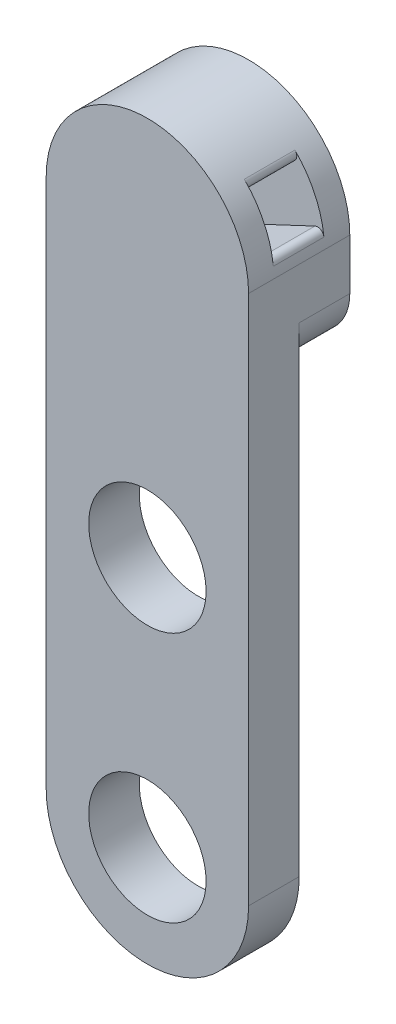
ISO-10303-21;
HEADER;
FILE_DESCRIPTION(('STEP AP214'),'2;1');
FILE_NAME('part.step','',(''),(''),'','','');
FILE_SCHEMA(('AUTOMOTIVE_DESIGN { 1 0 10303 214 1 1 1 1 }'));
ENDSEC;
DATA;
#1=APPLICATION_CONTEXT('core data for automotive mechanical design processes');
#2=APPLICATION_PROTOCOL_DEFINITION('international standard','automotive_design',2000,#1);
#3=PRODUCT_CONTEXT('',#1,'mechanical');
#4=PRODUCT('Part','Part','',(#3));
#5=PRODUCT_RELATED_PRODUCT_CATEGORY('part','',(#4));
#6=PRODUCT_DEFINITION_FORMATION('','',#4);
#7=PRODUCT_DEFINITION_CONTEXT('part definition',#1,'design');
#8=PRODUCT_DEFINITION('design','',#6,#7);
#9=PRODUCT_DEFINITION_SHAPE('','',#8);
#10=(LENGTH_UNIT() NAMED_UNIT(*) SI_UNIT(.MILLI.,.METRE.));
#11=(NAMED_UNIT(*) PLANE_ANGLE_UNIT() SI_UNIT($,.RADIAN.));
#12=(NAMED_UNIT(*) SI_UNIT($,.STERADIAN.) SOLID_ANGLE_UNIT());
#13=UNCERTAINTY_MEASURE_WITH_UNIT(LENGTH_MEASURE(1.E-05),#10,'distance_accuracy_value','');
#14=(GEOMETRIC_REPRESENTATION_CONTEXT(3) GLOBAL_UNCERTAINTY_ASSIGNED_CONTEXT((#13)) GLOBAL_UNIT_ASSIGNED_CONTEXT((#10,
#11,#12)) REPRESENTATION_CONTEXT('',''));
#15=CARTESIAN_POINT('',(0.,0.,0.));
#16=DIRECTION('',(0.,0.,1.));
#17=DIRECTION('',(1.,0.,0.));
#18=AXIS2_PLACEMENT_3D('',#15,#16,#17);
#19=CARTESIAN_POINT('',(0.,0.,0.));
#20=DIRECTION('',(0.,0.,1.));
#21=DIRECTION('',(1.,0.,0.));
#22=AXIS2_PLACEMENT_3D('',#19,#20,#21);
#23=PLANE('',#22);
#24=CARTESIAN_POINT('',(14.2874647221787,0.0317500000000005,0.));
#25=DIRECTION('',(0.,0.,1.));
#26=DIRECTION('',(1.,0.,0.));
#27=AXIS2_PLACEMENT_3D('',#24,#25,#26);
#28=CIRCLE('',#27,1.8415);
#29=CARTESIAN_POINT('',(16.1289647221787,0.0317500000000005,0.));
#30=VERTEX_POINT('',#29);
#31=EDGE_CURVE('E210',#30,#30,#28,.T.);
#32=ORIENTED_EDGE('',*,*,#31,.T.);
#33=EDGE_LOOP('',(#32));
#34=FACE_BOUND('',#33,.T.);
#35=CARTESIAN_POINT('',(14.2874647221787,7.90575,0.));
#36=DIRECTION('',(0.,0.,1.));
#37=DIRECTION('',(1.,0.,0.));
#38=AXIS2_PLACEMENT_3D('',#35,#36,#37);
#39=CIRCLE('',#38,1.8415);
#40=CARTESIAN_POINT('',(16.1289647221787,7.90575,0.));
#41=VERTEX_POINT('',#40);
#42=EDGE_CURVE('E205',#41,#41,#39,.T.);
#43=ORIENTED_EDGE('',*,*,#42,.T.);
#44=EDGE_LOOP('',(#43));
#45=FACE_BOUND('',#44,.T.);
#46=DIRECTION('',(0.,-1.,0.));
#47=VECTOR('',#46,1.);
#48=CARTESIAN_POINT('',(11.1124647221787,0.,0.));
#49=LINE('',#48,#47);
#50=CARTESIAN_POINT('',(11.1124647221787,14.1838734793715,0.));
#51=VERTEX_POINT('',#50);
#52=CARTESIAN_POINT('',(11.1124647221787,0.0317500000000005,0.));
#53=VERTEX_POINT('',#52);
#54=EDGE_CURVE('E229',#51,#53,#49,.T.);
#55=ORIENTED_EDGE('',*,*,#54,.F.);
#56=CARTESIAN_POINT('',(11.3109149221787,14.1838734793715,0.));
#57=DIRECTION('',(0.,0.,1.));
#58=DIRECTION('',(1.,0.,0.));
#59=AXIS2_PLACEMENT_3D('',#56,#57,#58);
#60=CIRCLE('',#59,0.1984502);
#61=CARTESIAN_POINT('',(11.2263437288073,14.3634011795511,0.));
#62=VERTEX_POINT('',#61);
#63=EDGE_CURVE('E321',#51,#62,#60,.F.);
#64=ORIENTED_EDGE('',*,*,#63,.T.);
#65=DIRECTION('',(-0.904648623078337,-0.426158267269884,0.));
#66=VECTOR('',#65,1.);
#67=CARTESIAN_POINT('',(18.4427205728927,17.7628632175049,0.));
#68=LINE('',#67,#66);
#69=CARTESIAN_POINT('',(11.466359185223,14.4764667040152,0.));
#70=VERTEX_POINT('',#69);
#71=EDGE_CURVE('E279',#70,#62,#68,.T.);
#72=ORIENTED_EDGE('',*,*,#71,.F.);
#73=CARTESIAN_POINT('',(11.5509303785944,14.2969390038356,0.));
#74=DIRECTION('',(0.,0.,1.));
#75=DIRECTION('',(1.,0.,0.));
#76=AXIS2_PLACEMENT_3D('',#73,#74,#75);
#77=CIRCLE('',#76,0.1984502);
#78=CARTESIAN_POINT('',(11.386770608879,14.1854309239174,0.));
#79=VERTEX_POINT('',#78);
#80=EDGE_CURVE('E49',#70,#79,#77,.T.);
#81=ORIENTED_EDGE('',*,*,#80,.T.);
#82=CARTESIAN_POINT('',(12.6999647221787,15.0774384747796,0.));
#83=DIRECTION('',(0.,0.,1.));
#84=DIRECTION('',(1.,0.,0.));
#85=AXIS2_PLACEMENT_3D('',#82,#83,#84);
#86=CIRCLE('',#85,1.5875);
#87=CARTESIAN_POINT('',(13.2023381399002,13.5715244004823,0.));
#88=VERTEX_POINT('',#87);
#89=EDGE_CURVE('E287',#79,#88,#86,.T.);
#90=ORIENTED_EDGE('',*,*,#89,.T.);
#91=CARTESIAN_POINT('',(14.2874647221787,10.31875,0.));
#92=DIRECTION('',(0.,0.,-1.));
#93=DIRECTION('',(-1.,0.,0.));
#94=AXIS2_PLACEMENT_3D('',#91,#92,#93);
#95=CIRCLE('',#94,3.429);
#96=CARTESIAN_POINT('',(15.3725913044571,13.5715244004822,0.));
#97=VERTEX_POINT('',#96);
#98=EDGE_CURVE('E195',#88,#97,#95,.T.);
#99=ORIENTED_EDGE('',*,*,#98,.T.);
#100=CARTESIAN_POINT('',(15.8749647221787,15.0774384747796,0.));
#101=DIRECTION('',(0.,0.,1.));
#102=DIRECTION('',(1.,0.,0.));
#103=AXIS2_PLACEMENT_3D('',#100,#101,#102);
#104=CIRCLE('',#103,1.5875);
#105=CARTESIAN_POINT('',(17.4624647221787,15.0774384747796,0.));
#106=VERTEX_POINT('',#105);
#107=EDGE_CURVE('E283',#97,#106,#104,.T.);
#108=ORIENTED_EDGE('',*,*,#107,.T.);
#109=DIRECTION('',(0.,-1.,0.));
#110=VECTOR('',#109,1.);
#111=CARTESIAN_POINT('',(17.4624647221787,0.,0.));
#112=LINE('',#111,#110);
#113=CARTESIAN_POINT('',(17.4624647221787,0.0317500000000005,0.));
#114=VERTEX_POINT('',#113);
#115=EDGE_CURVE('E236',#106,#114,#112,.T.);
#116=ORIENTED_EDGE('',*,*,#115,.T.);
#117=CARTESIAN_POINT('',(14.2874647221787,0.0317500000000005,0.));
#118=DIRECTION('',(0.,0.,1.));
#119=DIRECTION('',(1.,0.,0.));
#120=AXIS2_PLACEMENT_3D('',#117,#118,#119);
#121=CIRCLE('',#120,3.175);
#122=EDGE_CURVE('E232',#53,#114,#121,.T.);
#123=ORIENTED_EDGE('',*,*,#122,.F.);
#124=EDGE_LOOP('',(#55,#64,#72,#81,#90,#99,#108,#116,#123));
#125=FACE_BOUND('',#124,.T.);
#126=ADVANCED_FACE('F40',(#34,#45,#125),#23,.F.);
#127=CARTESIAN_POINT('',(11.1124647221787,0.,1.5875));
#128=DIRECTION('',(1.,0.,0.));
#129=DIRECTION('',(0.,1.,0.));
#130=AXIS2_PLACEMENT_3D('',#127,#128,#129);
#131=PLANE('',#130);
#132=DIRECTION('',(0.,0.,1.));
#133=VECTOR('',#132,1.);
#134=CARTESIAN_POINT('',(11.1124647221787,16.3774327789452,1.5875));
#135=LINE('',#134,#133);
#136=CARTESIAN_POINT('',(11.1124647221787,16.3774327789452,-0.79375));
#137=VERTEX_POINT('',#136);
#138=CARTESIAN_POINT('',(11.1124647221787,16.3774327789452,0.79375));
#139=VERTEX_POINT('',#138);
#140=EDGE_CURVE('E294',#137,#139,#135,.T.);
#141=ORIENTED_EDGE('',*,*,#140,.T.);
#142=DIRECTION('',(0.,-1.,0.));
#143=VECTOR('',#142,1.);
#144=CARTESIAN_POINT('',(11.1124647221787,0.,0.79375));
#145=LINE('',#144,#143);
#146=CARTESIAN_POINT('',(11.1124647221787,14.1838734793715,0.79375));
#147=VERTEX_POINT('',#146);
#148=EDGE_CURVE('E358',#139,#147,#145,.T.);
#149=ORIENTED_EDGE('',*,*,#148,.T.);
#150=DIRECTION('',(0.,0.,-1.));
#151=VECTOR('',#150,1.);
#152=CARTESIAN_POINT('',(11.1124647221787,14.1838734793715,1.5875));
#153=LINE('',#152,#151);
#154=EDGE_CURVE('E290',#147,#51,#153,.T.);
#155=ORIENTED_EDGE('',*,*,#154,.T.);
#156=ORIENTED_EDGE('',*,*,#54,.T.);
#157=DIRECTION('',(0.,0.,-1.));
#158=VECTOR('',#157,1.);
#159=CARTESIAN_POINT('',(11.1124647221787,0.0317500000000005,1.5875));
#160=LINE('',#159,#158);
#161=CARTESIAN_POINT('',(11.1124647221787,0.0317500000000005,1.5875));
#162=VERTEX_POINT('',#161);
#163=EDGE_CURVE('E248',#162,#53,#160,.T.);
#164=ORIENTED_EDGE('',*,*,#163,.F.);
#165=DIRECTION('',(0.,-1.,0.));
#166=VECTOR('',#165,1.);
#167=CARTESIAN_POINT('',(11.1124647221787,0.,1.5875));
#168=LINE('',#167,#166);
#169=CARTESIAN_POINT('',(11.1124647221787,16.66875,1.5875));
#170=VERTEX_POINT('',#169);
#171=EDGE_CURVE('E174',#170,#162,#168,.T.);
#172=ORIENTED_EDGE('',*,*,#171,.F.);
#173=DIRECTION('',(0.,0.,-1.));
#174=VECTOR('',#173,1.);
#175=CARTESIAN_POINT('',(11.1124647221787,16.66875,1.5875));
#176=LINE('',#175,#174);
#177=CARTESIAN_POINT('',(11.1124647221787,16.66875,-1.5875));
#178=VERTEX_POINT('',#177);
#179=EDGE_CURVE('E166',#170,#178,#176,.T.);
#180=ORIENTED_EDGE('',*,*,#179,.T.);
#181=DIRECTION('',(0.,-1.,0.));
#182=VECTOR('',#181,1.);
#183=CARTESIAN_POINT('',(11.1124647221787,0.,-1.5875));
#184=LINE('',#183,#182);
#185=CARTESIAN_POINT('',(11.1124647221787,15.0774384747796,-1.5875));
#186=VERTEX_POINT('',#185);
#187=EDGE_CURVE('E170',#178,#186,#184,.T.);
#188=ORIENTED_EDGE('',*,*,#187,.T.);
#189=DIRECTION('',(0.,0.,-1.));
#190=VECTOR('',#189,1.);
#191=CARTESIAN_POINT('',(11.1124647221787,15.0774384747796,1.5875));
#192=LINE('',#191,#190);
#193=CARTESIAN_POINT('',(11.1124647221787,15.0774384747796,-0.79375));
#194=VERTEX_POINT('',#193);
#195=EDGE_CURVE('E274',#186,#194,#192,.F.);
#196=ORIENTED_EDGE('',*,*,#195,.T.);
#197=DIRECTION('',(0.,1.,0.));
#198=VECTOR('',#197,1.);
#199=CARTESIAN_POINT('',(11.1124647221787,0.,-0.79375));
#200=LINE('',#199,#198);
#201=EDGE_CURVE('E390',#194,#137,#200,.T.);
#202=ORIENTED_EDGE('',*,*,#201,.T.);
#203=EDGE_LOOP('',(#141,#149,#155,#156,#164,#172,#180,#188,#196,#202));
#204=FACE_BOUND('',#203,.T.);
#205=ADVANCED_FACE('F169',(#204),#131,.F.);
#206=CARTESIAN_POINT('',(14.2874647221787,0.0317500000000005,1.5875));
#207=DIRECTION('',(0.,0.,-1.));
#208=DIRECTION('',(-1.,0.,0.));
#209=AXIS2_PLACEMENT_3D('',#206,#207,#208);
#210=CYLINDRICAL_SURFACE('',#209,3.175);
#211=ORIENTED_EDGE('',*,*,#122,.T.);
#212=DIRECTION('',(0.,0.,-1.));
#213=VECTOR('',#212,1.);
#214=CARTESIAN_POINT('',(17.4624647221787,0.0317500000000005,1.5875));
#215=LINE('',#214,#213);
#216=CARTESIAN_POINT('',(17.4624647221787,0.0317500000000005,1.5875));
#217=VERTEX_POINT('',#216);
#218=EDGE_CURVE('E244',#217,#114,#215,.T.);
#219=ORIENTED_EDGE('',*,*,#218,.F.);
#220=CARTESIAN_POINT('',(14.2874647221787,0.0317500000000005,1.5875));
#221=DIRECTION('',(0.,0.,1.));
#222=DIRECTION('',(1.,0.,0.));
#223=AXIS2_PLACEMENT_3D('',#220,#221,#222);
#224=CIRCLE('',#223,3.175);
#225=EDGE_CURVE('E213',#162,#217,#224,.T.);
#226=ORIENTED_EDGE('',*,*,#225,.F.);
#227=ORIENTED_EDGE('',*,*,#163,.T.);
#228=EDGE_LOOP('',(#211,#219,#226,#227));
#229=FACE_BOUND('',#228,.T.);
#230=ADVANCED_FACE('F369',(#229),#210,.T.);
#231=CARTESIAN_POINT('',(17.4624647221787,0.,1.5875));
#232=DIRECTION('',(1.,0.,0.));
#233=DIRECTION('',(0.,0.,-1.));
#234=AXIS2_PLACEMENT_3D('',#231,#232,#233);
#235=PLANE('',#234);
#236=ORIENTED_EDGE('',*,*,#115,.F.);
#237=DIRECTION('',(0.,0.,1.));
#238=VECTOR('',#237,1.);
#239=CARTESIAN_POINT('',(17.4624647221787,15.0774384747796,-1.5875));
#240=LINE('',#239,#238);
#241=CARTESIAN_POINT('',(17.4624647221787,15.0774384747796,-1.5875));
#242=VERTEX_POINT('',#241);
#243=EDGE_CURVE('E258',#106,#242,#240,.F.);
#244=ORIENTED_EDGE('',*,*,#243,.T.);
#245=DIRECTION('',(0.,-1.,0.));
#246=VECTOR('',#245,1.);
#247=CARTESIAN_POINT('',(17.4624647221787,0.,-1.5875));
#248=LINE('',#247,#246);
#249=CARTESIAN_POINT('',(17.4624647221787,16.66875,-1.5875));
#250=VERTEX_POINT('',#249);
#251=EDGE_CURVE('E190',#250,#242,#248,.T.);
#252=ORIENTED_EDGE('',*,*,#251,.F.);
#253=DIRECTION('',(0.,0.,-1.));
#254=VECTOR('',#253,1.);
#255=CARTESIAN_POINT('',(17.4624647221787,16.66875,1.5875));
#256=LINE('',#255,#254);
#257=CARTESIAN_POINT('',(17.4624647221787,16.66875,1.5875));
#258=VERTEX_POINT('',#257);
#259=EDGE_CURVE('E179',#258,#250,#256,.T.);
#260=ORIENTED_EDGE('',*,*,#259,.F.);
#261=DIRECTION('',(0.,-1.,0.));
#262=VECTOR('',#261,1.);
#263=CARTESIAN_POINT('',(17.4624647221787,0.,1.5875));
#264=LINE('',#263,#262);
#265=EDGE_CURVE('E216',#258,#217,#264,.T.);
#266=ORIENTED_EDGE('',*,*,#265,.T.);
#267=ORIENTED_EDGE('',*,*,#218,.T.);
#268=EDGE_LOOP('',(#236,#244,#252,#260,#266,#267));
#269=FACE_BOUND('',#268,.T.);
#270=ADVANCED_FACE('F375',(#269),#235,.T.);
#271=CARTESIAN_POINT('',(14.2874647221787,16.66875,1.5875));
#272=DIRECTION('',(0.,0.,-1.));
#273=DIRECTION('',(-1.,0.,0.));
#274=AXIS2_PLACEMENT_3D('',#271,#272,#273);
#275=CYLINDRICAL_SURFACE('',#274,3.175);
#276=DIRECTION('',(0.,0.,-1.));
#277=VECTOR('',#276,1.);
#278=CARTESIAN_POINT('',(16.5342555415231,18.9120859120091,1.5875));
#279=LINE('',#278,#277);
#280=CARTESIAN_POINT('',(16.5342555415231,18.9120859120091,0.79375));
#281=VERTEX_POINT('',#280);
#282=CARTESIAN_POINT('',(16.5342555415231,18.9120859120091,-0.79375));
#283=VERTEX_POINT('',#282);
#284=EDGE_CURVE('E307',#281,#283,#279,.T.);
#285=ORIENTED_EDGE('',*,*,#284,.T.);
#286=CARTESIAN_POINT('',(14.2874647221787,16.66875,-0.79375));
#287=DIRECTION('',(0.,0.,-1.));
#288=DIRECTION('',(-1.,0.,0.));
#289=AXIS2_PLACEMENT_3D('',#286,#287,#288);
#290=CIRCLE('',#289,3.175);
#291=CARTESIAN_POINT('',(17.4450000512953,17.0013092358968,-0.79375));
#292=VERTEX_POINT('',#291);
#293=EDGE_CURVE('E252',#283,#292,#290,.T.);
#294=ORIENTED_EDGE('',*,*,#293,.T.);
#295=DIRECTION('',(0.,0.,-1.));
#296=VECTOR('',#295,1.);
#297=CARTESIAN_POINT('',(17.4450000512953,17.0013092358968,1.5875));
#298=LINE('',#297,#296);
#299=CARTESIAN_POINT('',(17.4450000512953,17.0013092358968,0.79375));
#300=VERTEX_POINT('',#299);
#301=EDGE_CURVE('E303',#292,#300,#298,.F.);
#302=ORIENTED_EDGE('',*,*,#301,.T.);
#303=CARTESIAN_POINT('',(14.2874647221787,16.66875,0.79375));
#304=DIRECTION('',(0.,0.,1.));
#305=DIRECTION('',(1.,0.,0.));
#306=AXIS2_PLACEMENT_3D('',#303,#304,#305);
#307=CIRCLE('',#306,3.175);
#308=EDGE_CURVE('E255',#300,#281,#307,.T.);
#309=ORIENTED_EDGE('',*,*,#308,.T.);
#310=EDGE_LOOP('',(#285,#294,#302,#309));
#311=FACE_BOUND('',#310,.T.);
#312=ORIENTED_EDGE('',*,*,#259,.T.);
#313=CARTESIAN_POINT('',(14.2874647221787,16.66875,-1.5875));
#314=DIRECTION('',(0.,0.,1.));
#315=DIRECTION('',(1.,0.,0.));
#316=AXIS2_PLACEMENT_3D('',#313,#314,#315);
#317=CIRCLE('',#316,3.175);
#318=EDGE_CURVE('E186',#250,#178,#317,.T.);
#319=ORIENTED_EDGE('',*,*,#318,.T.);
#320=ORIENTED_EDGE('',*,*,#179,.F.);
#321=CARTESIAN_POINT('',(14.2874647221787,16.66875,1.5875));
#322=DIRECTION('',(0.,0.,1.));
#323=DIRECTION('',(1.,0.,0.));
#324=AXIS2_PLACEMENT_3D('',#321,#322,#323);
#325=CIRCLE('',#324,3.175);
#326=EDGE_CURVE('E220',#258,#170,#325,.T.);
#327=ORIENTED_EDGE('',*,*,#326,.F.);
#328=EDGE_LOOP('',(#312,#319,#320,#327));
#329=FACE_BOUND('',#328,.T.);
#330=ADVANCED_FACE('F192',(#311,#329),#275,.T.);
#331=CARTESIAN_POINT('',(14.2874647221787,7.90575,1.5875));
#332=DIRECTION('',(0.,0.,-1.));
#333=DIRECTION('',(-1.,0.,0.));
#334=AXIS2_PLACEMENT_3D('',#331,#332,#333);
#335=CYLINDRICAL_SURFACE('',#334,1.8415);
#336=CARTESIAN_POINT('',(14.2874647221787,7.90575,1.5875));
#337=DIRECTION('',(0.,0.,1.));
#338=DIRECTION('',(1.,0.,0.));
#339=AXIS2_PLACEMENT_3D('',#336,#337,#338);
#340=CIRCLE('',#339,1.8415);
#341=CARTESIAN_POINT('',(16.1289647221787,7.90575,1.5875));
#342=VERTEX_POINT('',#341);
#343=EDGE_CURVE('E206',#342,#342,#340,.T.);
#344=ORIENTED_EDGE('',*,*,#343,.T.);
#345=EDGE_LOOP('',(#344));
#346=FACE_BOUND('',#345,.T.);
#347=ORIENTED_EDGE('',*,*,#42,.F.);
#348=EDGE_LOOP('',(#347));
#349=FACE_BOUND('',#348,.T.);
#350=ADVANCED_FACE('F440',(#346,#349),#335,.F.);
#351=CARTESIAN_POINT('',(14.2874647221787,0.0317500000000005,1.5875));
#352=DIRECTION('',(0.,0.,-1.));
#353=DIRECTION('',(-1.,0.,0.));
#354=AXIS2_PLACEMENT_3D('',#351,#352,#353);
#355=CYLINDRICAL_SURFACE('',#354,1.8415);
#356=CARTESIAN_POINT('',(14.2874647221787,0.0317500000000005,1.5875));
#357=DIRECTION('',(0.,0.,1.));
#358=DIRECTION('',(1.,0.,0.));
#359=AXIS2_PLACEMENT_3D('',#356,#357,#358);
#360=CIRCLE('',#359,1.8415);
#361=CARTESIAN_POINT('',(16.1289647221787,0.0317500000000005,1.5875));
#362=VERTEX_POINT('',#361);
#363=EDGE_CURVE('E180',#362,#362,#360,.T.);
#364=ORIENTED_EDGE('',*,*,#363,.T.);
#365=EDGE_LOOP('',(#364));
#366=FACE_BOUND('',#365,.T.);
#367=ORIENTED_EDGE('',*,*,#31,.F.);
#368=EDGE_LOOP('',(#367));
#369=FACE_BOUND('',#368,.T.);
#370=ADVANCED_FACE('F437',(#366,#369),#355,.F.);
#371=CARTESIAN_POINT('',(0.,0.,1.5875));
#372=DIRECTION('',(0.,0.,1.));
#373=DIRECTION('',(1.,0.,0.));
#374=AXIS2_PLACEMENT_3D('',#371,#372,#373);
#375=PLANE('',#374);
#376=ORIENTED_EDGE('',*,*,#343,.F.);
#377=EDGE_LOOP('',(#376));
#378=FACE_BOUND('',#377,.T.);
#379=ORIENTED_EDGE('',*,*,#171,.T.);
#380=ORIENTED_EDGE('',*,*,#225,.T.);
#381=ORIENTED_EDGE('',*,*,#265,.F.);
#382=ORIENTED_EDGE('',*,*,#326,.T.);
#383=EDGE_LOOP('',(#379,#380,#381,#382));
#384=FACE_BOUND('',#383,.T.);
#385=ORIENTED_EDGE('',*,*,#363,.F.);
#386=EDGE_LOOP('',(#385));
#387=FACE_BOUND('',#386,.T.);
#388=ADVANCED_FACE('F372',(#378,#384,#387),#375,.T.);
#389=CARTESIAN_POINT('',(0.,0.,-1.5875));
#390=DIRECTION('',(0.,0.,1.));
#391=DIRECTION('',(1.,0.,0.));
#392=AXIS2_PLACEMENT_3D('',#389,#390,#391);
#393=PLANE('',#392);
#394=ORIENTED_EDGE('',*,*,#251,.T.);
#395=CARTESIAN_POINT('',(15.8749647221787,15.0774384747796,-1.5875));
#396=DIRECTION('',(0.,0.,1.));
#397=DIRECTION('',(1.,0.,0.));
#398=AXIS2_PLACEMENT_3D('',#395,#396,#397);
#399=CIRCLE('',#398,1.5875);
#400=CARTESIAN_POINT('',(15.3725913044571,13.5715244004822,-1.5875));
#401=VERTEX_POINT('',#400);
#402=EDGE_CURVE('E264',#242,#401,#399,.F.);
#403=ORIENTED_EDGE('',*,*,#402,.T.);
#404=CARTESIAN_POINT('',(14.2874647221787,10.31875,-1.5875));
#405=DIRECTION('',(0.,0.,-1.));
#406=DIRECTION('',(-1.,0.,0.));
#407=AXIS2_PLACEMENT_3D('',#404,#405,#406);
#408=CIRCLE('',#407,3.429);
#409=CARTESIAN_POINT('',(13.2023381399002,13.5715244004823,-1.5875));
#410=VERTEX_POINT('',#409);
#411=EDGE_CURVE('E199',#410,#401,#408,.T.);
#412=ORIENTED_EDGE('',*,*,#411,.F.);
#413=CARTESIAN_POINT('',(12.6999647221787,15.0774384747796,-1.5875));
#414=DIRECTION('',(0.,0.,1.));
#415=DIRECTION('',(1.,0.,0.));
#416=AXIS2_PLACEMENT_3D('',#413,#414,#415);
#417=CIRCLE('',#416,1.5875);
#418=EDGE_CURVE('E188',#410,#186,#417,.F.);
#419=ORIENTED_EDGE('',*,*,#418,.T.);
#420=ORIENTED_EDGE('',*,*,#187,.F.);
#421=ORIENTED_EDGE('',*,*,#318,.F.);
#422=EDGE_LOOP('',(#394,#403,#412,#419,#420,#421));
#423=FACE_BOUND('',#422,.T.);
#424=ADVANCED_FACE('F185',(#423),#393,.F.);
#425=CARTESIAN_POINT('',(14.2874647221787,10.31875,0.));
#426=DIRECTION('',(0.,0.,-1.));
#427=DIRECTION('',(-1.,0.,0.));
#428=AXIS2_PLACEMENT_3D('',#425,#426,#427);
#429=CYLINDRICAL_SURFACE('',#428,3.429);
#430=ORIENTED_EDGE('',*,*,#411,.T.);
#431=DIRECTION('',(0.,0.,-1.));
#432=VECTOR('',#431,1.);
#433=CARTESIAN_POINT('',(15.3725913044571,13.5715244004822,0.));
#434=LINE('',#433,#432);
#435=EDGE_CURVE('E271',#401,#97,#434,.F.);
#436=ORIENTED_EDGE('',*,*,#435,.T.);
#437=ORIENTED_EDGE('',*,*,#98,.F.);
#438=DIRECTION('',(0.,0.,-1.));
#439=VECTOR('',#438,1.);
#440=CARTESIAN_POINT('',(13.2023381399002,13.5715244004823,0.));
#441=LINE('',#440,#439);
#442=EDGE_CURVE('E267',#88,#410,#441,.T.);
#443=ORIENTED_EDGE('',*,*,#442,.T.);
#444=EDGE_LOOP('',(#430,#436,#437,#443));
#445=FACE_BOUND('',#444,.T.);
#446=ADVANCED_FACE('F381',(#445),#429,.F.);
#447=CARTESIAN_POINT('',(18.4427205728927,17.7628632175049,0.79375));
#448=DIRECTION('',(0.,0.,1.));
#449=DIRECTION('',(1.,0.,0.));
#450=AXIS2_PLACEMENT_3D('',#447,#448,#449);
#451=PLANE('',#450);
#452=DIRECTION('',(-0.904648623078336,-0.426158267269884,0.));
#453=VECTOR('',#452,1.);
#454=CARTESIAN_POINT('',(17.7661943236018,19.1989929066417,0.79375));
#455=LINE('',#454,#453);
#456=CARTESIAN_POINT('',(16.4783933215221,18.5923407439853,0.79375));
#457=VERTEX_POINT('',#456);
#458=CARTESIAN_POINT('',(11.39548611555,16.1979050787655,0.79375));
#459=VERTEX_POINT('',#458);
#460=EDGE_CURVE('E403',#457,#459,#455,.T.);
#461=ORIENTED_EDGE('',*,*,#460,.F.);
#462=CARTESIAN_POINT('',(16.3938221281508,18.7718684441649,0.79375));
#463=DIRECTION('',(0.,0.,1.));
#464=DIRECTION('',(1.,0.,0.));
#465=AXIS2_PLACEMENT_3D('',#462,#463,#464);
#466=CIRCLE('',#465,0.1984502);
#467=EDGE_CURVE('E337',#457,#281,#466,.T.);
#468=ORIENTED_EDGE('',*,*,#467,.T.);
#469=ORIENTED_EDGE('',*,*,#308,.F.);
#470=CARTESIAN_POINT('',(17.2476414630842,16.9805229534163,0.79375));
#471=DIRECTION('',(0.,0.,1.));
#472=DIRECTION('',(1.,0.,0.));
#473=AXIS2_PLACEMENT_3D('',#470,#471,#472);
#474=CIRCLE('',#473,0.1984502);
#475=CARTESIAN_POINT('',(17.1630702697128,17.160050653596,0.79375));
#476=VERTEX_POINT('',#475);
#477=EDGE_CURVE('E341',#300,#476,#474,.T.);
#478=ORIENTED_EDGE('',*,*,#477,.T.);
#479=DIRECTION('',(-0.904648623078336,-0.426158267269884,0.));
#480=VECTOR('',#479,1.);
#481=CARTESIAN_POINT('',(18.4427205728927,17.7628632175049,0.79375));
#482=LINE('',#481,#480);
#483=CARTESIAN_POINT('',(11.2263437288073,14.3634011795511,0.79375));
#484=VERTEX_POINT('',#483);
#485=EDGE_CURVE('E361',#476,#484,#482,.T.);
#486=ORIENTED_EDGE('',*,*,#485,.T.);
#487=CARTESIAN_POINT('',(11.3109149221787,14.1838734793715,0.79375));
#488=DIRECTION('',(0.,0.,1.));
#489=DIRECTION('',(1.,0.,0.));
#490=AXIS2_PLACEMENT_3D('',#487,#488,#489);
#491=CIRCLE('',#490,0.1984502);
#492=EDGE_CURVE('E348',#484,#147,#491,.T.);
#493=ORIENTED_EDGE('',*,*,#492,.T.);
#494=ORIENTED_EDGE('',*,*,#148,.F.);
#495=CARTESIAN_POINT('',(11.3109149221787,16.3774327789452,0.79375));
#496=DIRECTION('',(0.,0.,1.));
#497=DIRECTION('',(1.,0.,0.));
#498=AXIS2_PLACEMENT_3D('',#495,#496,#497);
#499=CIRCLE('',#498,0.1984502);
#500=EDGE_CURVE('E327',#139,#459,#499,.T.);
#501=ORIENTED_EDGE('',*,*,#500,.T.);
#502=EDGE_LOOP('',(#461,#468,#469,#478,#486,#493,#494,#501));
#503=FACE_BOUND('',#502,.T.);
#504=ADVANCED_FACE('F357',(#503),#451,.F.);
#505=CARTESIAN_POINT('',(18.4427205728927,17.7628632175049,-0.79375));
#506=DIRECTION('',(0.426158267269884,-0.904648623078336,0.));
#507=DIRECTION('',(0.904648623078337,0.426158267269884,0.));
#508=AXIS2_PLACEMENT_3D('',#505,#506,#507);
#509=PLANE('',#508);
#510=ORIENTED_EDGE('',*,*,#485,.F.);
#511=DIRECTION('',(0.,0.,-1.));
#512=VECTOR('',#511,1.);
#513=CARTESIAN_POINT('',(17.1630702697128,17.160050653596,-0.79375));
#514=LINE('',#513,#512);
#515=CARTESIAN_POINT('',(17.1630702697128,17.160050653596,-0.79375));
#516=VERTEX_POINT('',#515);
#517=EDGE_CURVE('E318',#476,#516,#514,.T.);
#518=ORIENTED_EDGE('',*,*,#517,.T.);
#519=DIRECTION('',(-0.904648623078336,-0.426158267269884,0.));
#520=VECTOR('',#519,1.);
#521=CARTESIAN_POINT('',(18.4427205728927,17.7628632175049,-0.79375));
#522=LINE('',#521,#520);
#523=CARTESIAN_POINT('',(11.466359185223,14.4764667040152,-0.79375));
#524=VERTEX_POINT('',#523);
#525=EDGE_CURVE('E400',#516,#524,#522,.T.);
#526=ORIENTED_EDGE('',*,*,#525,.T.);
#527=DIRECTION('',(0.,0.,1.));
#528=VECTOR('',#527,1.);
#529=CARTESIAN_POINT('',(11.466359185223,14.4764667040152,0.));
#530=LINE('',#529,#528);
#531=EDGE_CURVE('E311',#524,#70,#530,.T.);
#532=ORIENTED_EDGE('',*,*,#531,.T.);
#533=ORIENTED_EDGE('',*,*,#71,.T.);
#534=DIRECTION('',(0.,0.,-1.));
#535=VECTOR('',#534,1.);
#536=CARTESIAN_POINT('',(11.2263437288073,14.3634011795511,-0.79375));
#537=LINE('',#536,#535);
#538=EDGE_CURVE('E315',#62,#484,#537,.F.);
#539=ORIENTED_EDGE('',*,*,#538,.T.);
#540=EDGE_LOOP('',(#510,#518,#526,#532,#533,#539));
#541=FACE_BOUND('',#540,.T.);
#542=ADVANCED_FACE('F415',(#541),#509,.F.);
#543=CARTESIAN_POINT('',(18.4427205728927,17.7628632175049,-0.79375));
#544=DIRECTION('',(0.,0.,-1.));
#545=DIRECTION('',(-1.,0.,0.));
#546=AXIS2_PLACEMENT_3D('',#543,#544,#545);
#547=PLANE('',#546);
#548=ORIENTED_EDGE('',*,*,#201,.F.);
#549=CARTESIAN_POINT('',(12.6999647221787,15.0774384747796,-0.79375));
#550=DIRECTION('',(0.,0.,-1.));
#551=DIRECTION('',(-1.,0.,0.));
#552=AXIS2_PLACEMENT_3D('',#549,#550,#551);
#553=CIRCLE('',#552,1.5875);
#554=CARTESIAN_POINT('',(11.386770608879,14.1854309239174,-0.79375));
#555=VERTEX_POINT('',#554);
#556=EDGE_CURVE('E55',#194,#555,#553,.F.);
#557=ORIENTED_EDGE('',*,*,#556,.T.);
#558=CARTESIAN_POINT('',(11.5509303785944,14.2969390038356,-0.79375));
#559=DIRECTION('',(0.,0.,-1.));
#560=DIRECTION('',(-1.,0.,0.));
#561=AXIS2_PLACEMENT_3D('',#558,#559,#560);
#562=CIRCLE('',#561,0.1984502);
#563=EDGE_CURVE('E11',#555,#524,#562,.T.);
#564=ORIENTED_EDGE('',*,*,#563,.T.);
#565=ORIENTED_EDGE('',*,*,#525,.F.);
#566=CARTESIAN_POINT('',(17.2476414630842,16.9805229534163,-0.79375));
#567=DIRECTION('',(0.,0.,-1.));
#568=DIRECTION('',(-1.,0.,0.));
#569=AXIS2_PLACEMENT_3D('',#566,#567,#568);
#570=CIRCLE('',#569,0.1984502);
#571=EDGE_CURVE('E344',#516,#292,#570,.T.);
#572=ORIENTED_EDGE('',*,*,#571,.T.);
#573=ORIENTED_EDGE('',*,*,#293,.F.);
#574=CARTESIAN_POINT('',(16.3938221281508,18.7718684441649,-0.79375));
#575=DIRECTION('',(0.,0.,-1.));
#576=DIRECTION('',(-1.,0.,0.));
#577=AXIS2_PLACEMENT_3D('',#574,#575,#576);
#578=CIRCLE('',#577,0.1984502);
#579=CARTESIAN_POINT('',(16.4783933215221,18.5923407439853,-0.79375));
#580=VERTEX_POINT('',#579);
#581=EDGE_CURVE('E334',#283,#580,#578,.T.);
#582=ORIENTED_EDGE('',*,*,#581,.T.);
#583=DIRECTION('',(-0.904648623078336,-0.426158267269884,0.));
#584=VECTOR('',#583,1.);
#585=CARTESIAN_POINT('',(17.7661943236018,19.1989929066417,-0.79375));
#586=LINE('',#585,#584);
#587=CARTESIAN_POINT('',(11.39548611555,16.1979050787655,-0.79375));
#588=VERTEX_POINT('',#587);
#589=EDGE_CURVE('E407',#580,#588,#586,.T.);
#590=ORIENTED_EDGE('',*,*,#589,.T.);
#591=CARTESIAN_POINT('',(11.3109149221787,16.3774327789452,-0.79375));
#592=DIRECTION('',(0.,0.,-1.));
#593=DIRECTION('',(-1.,0.,0.));
#594=AXIS2_PLACEMENT_3D('',#591,#592,#593);
#595=CIRCLE('',#594,0.1984502);
#596=EDGE_CURVE('E330',#588,#137,#595,.T.);
#597=ORIENTED_EDGE('',*,*,#596,.T.);
#598=EDGE_LOOP('',(#548,#557,#564,#565,#572,#573,#582,#590,#597));
#599=FACE_BOUND('',#598,.T.);
#600=ADVANCED_FACE('F391',(#599),#547,.F.);
#601=CARTESIAN_POINT('',(17.7661943236018,19.1989929066417,-0.79375));
#602=DIRECTION('',(-0.426158267269884,0.904648623078336,0.));
#603=DIRECTION('',(-0.904648623078337,-0.426158267269884,0.));
#604=AXIS2_PLACEMENT_3D('',#601,#602,#603);
#605=PLANE('',#604);
#606=ORIENTED_EDGE('',*,*,#460,.T.);
#607=DIRECTION('',(0.,0.,1.));
#608=VECTOR('',#607,1.);
#609=CARTESIAN_POINT('',(11.39548611555,16.1979050787655,-0.79375));
#610=LINE('',#609,#608);
#611=EDGE_CURVE('E300',#459,#588,#610,.F.);
#612=ORIENTED_EDGE('',*,*,#611,.T.);
#613=ORIENTED_EDGE('',*,*,#589,.F.);
#614=DIRECTION('',(0.,0.,-1.));
#615=VECTOR('',#614,1.);
#616=CARTESIAN_POINT('',(16.4783933215221,18.5923407439853,-0.79375));
#617=LINE('',#616,#615);
#618=EDGE_CURVE('E297',#580,#457,#617,.F.);
#619=ORIENTED_EDGE('',*,*,#618,.T.);
#620=EDGE_LOOP('',(#606,#612,#613,#619));
#621=FACE_BOUND('',#620,.T.);
#622=ADVANCED_FACE('F454',(#621),#605,.F.);
#623=CARTESIAN_POINT('',(15.8749647221787,15.0774384747796,0.));
#624=DIRECTION('',(0.,0.,-1.));
#625=DIRECTION('',(-1.,0.,0.));
#626=AXIS2_PLACEMENT_3D('',#623,#624,#625);
#627=CYLINDRICAL_SURFACE('',#626,1.5875);
#628=ORIENTED_EDGE('',*,*,#107,.F.);
#629=ORIENTED_EDGE('',*,*,#435,.F.);
#630=ORIENTED_EDGE('',*,*,#402,.F.);
#631=ORIENTED_EDGE('',*,*,#243,.F.);
#632=EDGE_LOOP('',(#628,#629,#630,#631));
#633=FACE_BOUND('',#632,.T.);
#634=ADVANCED_FACE('F386',(#633),#627,.T.);
#635=CARTESIAN_POINT('',(12.6999647221787,15.0774384747796,0.));
#636=DIRECTION('',(0.,0.,-1.));
#637=DIRECTION('',(-1.,0.,0.));
#638=AXIS2_PLACEMENT_3D('',#635,#636,#637);
#639=CYLINDRICAL_SURFACE('',#638,1.5875);
#640=ORIENTED_EDGE('',*,*,#89,.F.);
#641=DIRECTION('',(0.,0.,-1.));
#642=VECTOR('',#641,1.);
#643=CARTESIAN_POINT('',(11.386770608879,14.1854309239174,0.));
#644=LINE('',#643,#642);
#645=EDGE_CURVE('E324',#79,#555,#644,.T.);
#646=ORIENTED_EDGE('',*,*,#645,.T.);
#647=ORIENTED_EDGE('',*,*,#556,.F.);
#648=ORIENTED_EDGE('',*,*,#195,.F.);
#649=ORIENTED_EDGE('',*,*,#418,.F.);
#650=ORIENTED_EDGE('',*,*,#442,.F.);
#651=EDGE_LOOP('',(#640,#646,#647,#648,#649,#650));
#652=FACE_BOUND('',#651,.T.);
#653=ADVANCED_FACE('F388',(#652),#639,.T.);
#654=CARTESIAN_POINT('',(11.3109149221787,16.3774327789452,1.5875));
#655=DIRECTION('',(0.,0.,1.));
#656=DIRECTION('',(1.,0.,0.));
#657=AXIS2_PLACEMENT_3D('',#654,#655,#656);
#658=CYLINDRICAL_SURFACE('',#657,0.1984502);
#659=ORIENTED_EDGE('',*,*,#596,.F.);
#660=ORIENTED_EDGE('',*,*,#611,.F.);
#661=ORIENTED_EDGE('',*,*,#500,.F.);
#662=ORIENTED_EDGE('',*,*,#140,.F.);
#663=EDGE_LOOP('',(#659,#660,#661,#662));
#664=FACE_BOUND('',#663,.T.);
#665=ADVANCED_FACE('F457',(#664),#658,.T.);
#666=CARTESIAN_POINT('',(16.3938221281508,18.7718684441649,1.5875));
#667=DIRECTION('',(0.,0.,-1.));
#668=DIRECTION('',(-1.,0.,0.));
#669=AXIS2_PLACEMENT_3D('',#666,#667,#668);
#670=CYLINDRICAL_SURFACE('',#669,0.1984502);
#671=ORIENTED_EDGE('',*,*,#467,.F.);
#672=ORIENTED_EDGE('',*,*,#618,.F.);
#673=ORIENTED_EDGE('',*,*,#581,.F.);
#674=ORIENTED_EDGE('',*,*,#284,.F.);
#675=EDGE_LOOP('',(#671,#672,#673,#674));
#676=FACE_BOUND('',#675,.T.);
#677=ADVANCED_FACE('F460',(#676),#670,.T.);
#678=CARTESIAN_POINT('',(17.2476414630842,16.9805229534163,1.5875));
#679=DIRECTION('',(0.,0.,-1.));
#680=DIRECTION('',(-1.,0.,0.));
#681=AXIS2_PLACEMENT_3D('',#678,#679,#680);
#682=CYLINDRICAL_SURFACE('',#681,0.1984502);
#683=ORIENTED_EDGE('',*,*,#571,.F.);
#684=ORIENTED_EDGE('',*,*,#517,.F.);
#685=ORIENTED_EDGE('',*,*,#477,.F.);
#686=ORIENTED_EDGE('',*,*,#301,.F.);
#687=EDGE_LOOP('',(#683,#684,#685,#686));
#688=FACE_BOUND('',#687,.T.);
#689=ADVANCED_FACE('F424',(#688),#682,.T.);
#690=CARTESIAN_POINT('',(11.3109149221787,14.1838734793715,1.5875));
#691=DIRECTION('',(0.,0.,-1.));
#692=DIRECTION('',(-1.,0.,0.));
#693=AXIS2_PLACEMENT_3D('',#690,#691,#692);
#694=CYLINDRICAL_SURFACE('',#693,0.1984502);
#695=ORIENTED_EDGE('',*,*,#492,.F.);
#696=ORIENTED_EDGE('',*,*,#538,.F.);
#697=ORIENTED_EDGE('',*,*,#63,.F.);
#698=ORIENTED_EDGE('',*,*,#154,.F.);
#699=EDGE_LOOP('',(#695,#696,#697,#698));
#700=FACE_BOUND('',#699,.T.);
#701=ADVANCED_FACE('F364',(#700),#694,.T.);
#702=CARTESIAN_POINT('',(11.5509303785944,14.2969390038356,0.));
#703=DIRECTION('',(0.,0.,-1.));
#704=DIRECTION('',(-1.,0.,0.));
#705=AXIS2_PLACEMENT_3D('',#702,#703,#704);
#706=CYLINDRICAL_SURFACE('',#705,0.1984502);
#707=ORIENTED_EDGE('',*,*,#563,.F.);
#708=ORIENTED_EDGE('',*,*,#645,.F.);
#709=ORIENTED_EDGE('',*,*,#80,.F.);
#710=ORIENTED_EDGE('',*,*,#531,.F.);
#711=EDGE_LOOP('',(#707,#708,#709,#710));
#712=FACE_BOUND('',#711,.T.);
#713=ADVANCED_FACE('F42',(#712),#706,.T.);
#714=CLOSED_SHELL('',(#126,#205,#230,#270,#330,#350,#370,#388,#424,#446,#504,#542,#600,#622,
#634,#653,#665,#677,#689,#701,#713));
#715=MANIFOLD_SOLID_BREP('B2',#714);
#716=ADVANCED_BREP_SHAPE_REPRESENTATION('',(#18,#715),#14);
#717=SHAPE_DEFINITION_REPRESENTATION(#9,#716);
ENDSEC;
END-ISO-10303-21;
